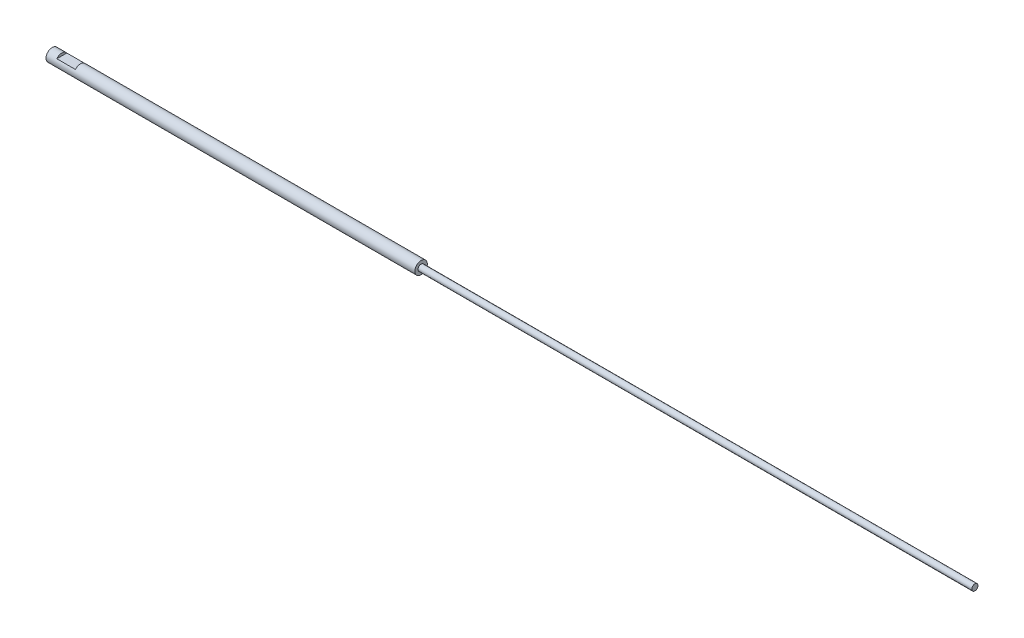
ISO-10303-21;
HEADER;
FILE_DESCRIPTION(('STEP AP214'),'2;1');
FILE_NAME('part.step','',(''),(''),'','','');
FILE_SCHEMA(('AUTOMOTIVE_DESIGN { 1 0 10303 214 1 1 1 1 }'));
ENDSEC;
DATA;
#1=APPLICATION_CONTEXT('core data for automotive mechanical design processes');
#2=APPLICATION_PROTOCOL_DEFINITION('international standard','automotive_design',2000,#1);
#3=PRODUCT_CONTEXT('',#1,'mechanical');
#4=PRODUCT('Part','Part','',(#3));
#5=PRODUCT_RELATED_PRODUCT_CATEGORY('part','',(#4));
#6=PRODUCT_DEFINITION_FORMATION('','',#4);
#7=PRODUCT_DEFINITION_CONTEXT('part definition',#1,'design');
#8=PRODUCT_DEFINITION('design','',#6,#7);
#9=PRODUCT_DEFINITION_SHAPE('','',#8);
#10=(LENGTH_UNIT() NAMED_UNIT(*) SI_UNIT(.MILLI.,.METRE.));
#11=(NAMED_UNIT(*) PLANE_ANGLE_UNIT() SI_UNIT($,.RADIAN.));
#12=(NAMED_UNIT(*) SI_UNIT($,.STERADIAN.) SOLID_ANGLE_UNIT());
#13=UNCERTAINTY_MEASURE_WITH_UNIT(LENGTH_MEASURE(1.E-05),#10,'distance_accuracy_value','');
#14=(GEOMETRIC_REPRESENTATION_CONTEXT(3) GLOBAL_UNCERTAINTY_ASSIGNED_CONTEXT((#13)) GLOBAL_UNIT_ASSIGNED_CONTEXT((#10,
#11,#12)) REPRESENTATION_CONTEXT('',''));
#15=CARTESIAN_POINT('',(0.,0.,0.));
#16=DIRECTION('',(0.,0.,1.));
#17=DIRECTION('',(1.,0.,0.));
#18=AXIS2_PLACEMENT_3D('',#15,#16,#17);
#19=CARTESIAN_POINT('',(256.066983307355,0.,0.));
#20=DIRECTION('',(-1.,0.,0.));
#21=DIRECTION('',(0.,0.,1.));
#22=AXIS2_PLACEMENT_3D('',#19,#20,#21);
#23=CYLINDRICAL_SURFACE('',#22,5.);
#24=CARTESIAN_POINT('',(27.7072594216369,0.,0.));
#25=DIRECTION('',(1.,0.,0.));
#26=DIRECTION('',(0.,0.,-1.));
#27=AXIS2_PLACEMENT_3D('',#24,#25,#26);
#28=CIRCLE('',#27,5.);
#29=CARTESIAN_POINT('',(27.7072594216369,3.,-4.));
#30=VERTEX_POINT('',#29);
#31=CARTESIAN_POINT('',(27.7072594216369,3.,4.));
#32=VERTEX_POINT('',#31);
#33=EDGE_CURVE('E43',#30,#32,#28,.T.);
#34=ORIENTED_EDGE('',*,*,#33,.T.);
#35=DIRECTION('',(-1.,0.,0.));
#36=VECTOR('',#35,1.);
#37=CARTESIAN_POINT('',(256.066983307355,3.,4.));
#38=LINE('',#37,#36);
#39=CARTESIAN_POINT('',(12.7072594216369,3.,4.));
#40=VERTEX_POINT('',#39);
#41=EDGE_CURVE('E11',#32,#40,#38,.T.);
#42=ORIENTED_EDGE('',*,*,#41,.T.);
#43=CARTESIAN_POINT('',(12.7072594216369,0.,0.));
#44=DIRECTION('',(-1.,0.,0.));
#45=DIRECTION('',(0.,0.,1.));
#46=AXIS2_PLACEMENT_3D('',#43,#44,#45);
#47=CIRCLE('',#46,5.);
#48=CARTESIAN_POINT('',(12.7072594216369,3.,-4.));
#49=VERTEX_POINT('',#48);
#50=EDGE_CURVE('E74',#40,#49,#47,.T.);
#51=ORIENTED_EDGE('',*,*,#50,.T.);
#52=DIRECTION('',(-1.,0.,0.));
#53=VECTOR('',#52,1.);
#54=CARTESIAN_POINT('',(256.066983307355,3.,-4.));
#55=LINE('',#54,#53);
#56=EDGE_CURVE('E73',#49,#30,#55,.F.);
#57=ORIENTED_EDGE('',*,*,#56,.T.);
#58=EDGE_LOOP('',(#34,#42,#51,#57));
#59=FACE_BOUND('',#58,.T.);
#60=CARTESIAN_POINT('',(301.25,0.,0.));
#61=DIRECTION('',(-1.,0.,0.));
#62=DIRECTION('',(0.,0.,1.));
#63=AXIS2_PLACEMENT_3D('',#60,#61,#62);
#64=CIRCLE('',#63,5.);
#65=CARTESIAN_POINT('',(301.25,0.,5.));
#66=VERTEX_POINT('',#65);
#67=EDGE_CURVE('E78',#66,#66,#64,.T.);
#68=ORIENTED_EDGE('',*,*,#67,.T.);
#69=EDGE_LOOP('',(#68));
#70=FACE_BOUND('',#69,.T.);
#71=CARTESIAN_POINT('',(5.,0.,0.));
#72=DIRECTION('',(-1.,0.,0.));
#73=DIRECTION('',(0.,0.,1.));
#74=AXIS2_PLACEMENT_3D('',#71,#72,#73);
#75=CIRCLE('',#74,5.);
#76=CARTESIAN_POINT('',(5.,0.,5.));
#77=VERTEX_POINT('',#76);
#78=EDGE_CURVE('E87',#77,#77,#75,.T.);
#79=ORIENTED_EDGE('',*,*,#78,.F.);
#80=EDGE_LOOP('',(#79));
#81=FACE_BOUND('',#80,.T.);
#82=ADVANCED_FACE('F35',(#59,#70,#81),#23,.T.);
#83=CARTESIAN_POINT('',(301.25,5.,0.));
#84=DIRECTION('',(-1.,0.,0.));
#85=DIRECTION('',(0.,0.,1.));
#86=AXIS2_PLACEMENT_3D('',#83,#84,#85);
#87=PLANE('',#86);
#88=ORIENTED_EDGE('',*,*,#67,.F.);
#89=EDGE_LOOP('',(#88));
#90=FACE_BOUND('',#89,.T.);
#91=CARTESIAN_POINT('',(301.25,0.,0.));
#92=DIRECTION('',(-1.,0.,0.));
#93=DIRECTION('',(0.,0.,1.));
#94=AXIS2_PLACEMENT_3D('',#91,#92,#93);
#95=CIRCLE('',#94,2.5);
#96=CARTESIAN_POINT('',(301.25,0.,2.5));
#97=VERTEX_POINT('',#96);
#98=EDGE_CURVE('E84',#97,#97,#95,.T.);
#99=ORIENTED_EDGE('',*,*,#98,.T.);
#100=EDGE_LOOP('',(#99));
#101=FACE_BOUND('',#100,.T.);
#102=ADVANCED_FACE('F37',(#90,#101),#87,.F.);
#103=CARTESIAN_POINT('',(745.975022487273,0.,0.));
#104=DIRECTION('',(-1.,0.,0.));
#105=DIRECTION('',(0.,0.,1.));
#106=AXIS2_PLACEMENT_3D('',#103,#104,#105);
#107=CONICAL_SURFACE('',#106,0.,1.57078786225236);
#108=CARTESIAN_POINT('',(745.975001325917,0.,0.));
#109=DIRECTION('',(-1.,0.,0.));
#110=DIRECTION('',(0.,0.,1.));
#111=AXIS2_PLACEMENT_3D('',#108,#109,#110);
#112=CIRCLE('',#111,2.5);
#113=CARTESIAN_POINT('',(745.975001325917,0.,2.5));
#114=VERTEX_POINT('',#113);
#115=EDGE_CURVE('E81',#114,#114,#112,.T.);
#116=ORIENTED_EDGE('',*,*,#115,.F.);
#117=EDGE_LOOP('',(#116));
#118=FACE_BOUND('',#117,.T.);
#119=CARTESIAN_POINT('',(745.975022487273,0.,0.));
#120=VERTEX_POINT('',#119);
#121=VERTEX_LOOP('',#120);
#122=FACE_BOUND('',#121,.T.);
#123=ADVANCED_FACE('F98',(#118,#122),#107,.T.);
#124=CARTESIAN_POINT('',(256.066983307355,0.,0.));
#125=DIRECTION('',(-1.,0.,0.));
#126=DIRECTION('',(0.,0.,1.));
#127=AXIS2_PLACEMENT_3D('',#124,#125,#126);
#128=CYLINDRICAL_SURFACE('',#127,2.5);
#129=ORIENTED_EDGE('',*,*,#98,.F.);
#130=EDGE_LOOP('',(#129));
#131=FACE_BOUND('',#130,.T.);
#132=ORIENTED_EDGE('',*,*,#115,.T.);
#133=EDGE_LOOP('',(#132));
#134=FACE_BOUND('',#133,.T.);
#135=ADVANCED_FACE('F103',(#131,#134),#128,.T.);
#136=CARTESIAN_POINT('',(5.,0.,0.));
#137=DIRECTION('',(-1.,0.,0.));
#138=DIRECTION('',(0.,0.,1.));
#139=AXIS2_PLACEMENT_3D('',#136,#137,#138);
#140=PLANE('',#139);
#141=ORIENTED_EDGE('',*,*,#78,.T.);
#142=EDGE_LOOP('',(#141));
#143=FACE_BOUND('',#142,.T.);
#144=ADVANCED_FACE('F92',(#143),#140,.T.);
#145=CARTESIAN_POINT('',(27.7072594216369,3.,5.));
#146=DIRECTION('',(1.,0.,0.));
#147=DIRECTION('',(0.,0.,-1.));
#148=AXIS2_PLACEMENT_3D('',#145,#146,#147);
#149=PLANE('',#148);
#150=DIRECTION('',(0.,0.,-1.));
#151=VECTOR('',#150,1.);
#152=CARTESIAN_POINT('',(27.7072594216369,3.,5.));
#153=LINE('',#152,#151);
#154=EDGE_CURVE('E50',#32,#30,#153,.T.);
#155=ORIENTED_EDGE('',*,*,#154,.F.);
#156=ORIENTED_EDGE('',*,*,#33,.F.);
#157=EDGE_LOOP('',(#155,#156));
#158=FACE_BOUND('',#157,.T.);
#159=ADVANCED_FACE('F69',(#158),#149,.F.);
#160=CARTESIAN_POINT('',(12.7072594216369,3.,5.));
#161=DIRECTION('',(-1.,0.,0.));
#162=DIRECTION('',(0.,0.,1.));
#163=AXIS2_PLACEMENT_3D('',#160,#161,#162);
#164=PLANE('',#163);
#165=DIRECTION('',(0.,0.,1.));
#166=VECTOR('',#165,1.);
#167=CARTESIAN_POINT('',(12.7072594216369,3.,5.));
#168=LINE('',#167,#166);
#169=EDGE_CURVE('E64',#49,#40,#168,.T.);
#170=ORIENTED_EDGE('',*,*,#169,.F.);
#171=ORIENTED_EDGE('',*,*,#50,.F.);
#172=EDGE_LOOP('',(#170,#171));
#173=FACE_BOUND('',#172,.T.);
#174=ADVANCED_FACE('F112',(#173),#164,.F.);
#175=CARTESIAN_POINT('',(0.,3.,0.));
#176=DIRECTION('',(0.,-1.,0.));
#177=DIRECTION('',(0.,0.,-1.));
#178=AXIS2_PLACEMENT_3D('',#175,#176,#177);
#179=PLANE('',#178);
#180=ORIENTED_EDGE('',*,*,#154,.T.);
#181=ORIENTED_EDGE('',*,*,#56,.F.);
#182=ORIENTED_EDGE('',*,*,#169,.T.);
#183=ORIENTED_EDGE('',*,*,#41,.F.);
#184=EDGE_LOOP('',(#180,#181,#182,#183));
#185=FACE_BOUND('',#184,.T.);
#186=ADVANCED_FACE('F62',(#185),#179,.F.);
#187=CLOSED_SHELL('',(#82,#102,#123,#135,#144,#159,#174,#186));
#188=MANIFOLD_SOLID_BREP('B2',#187);
#189=ADVANCED_BREP_SHAPE_REPRESENTATION('',(#18,#188),#14);
#190=SHAPE_DEFINITION_REPRESENTATION(#9,#189);
ENDSEC;
END-ISO-10303-21;
